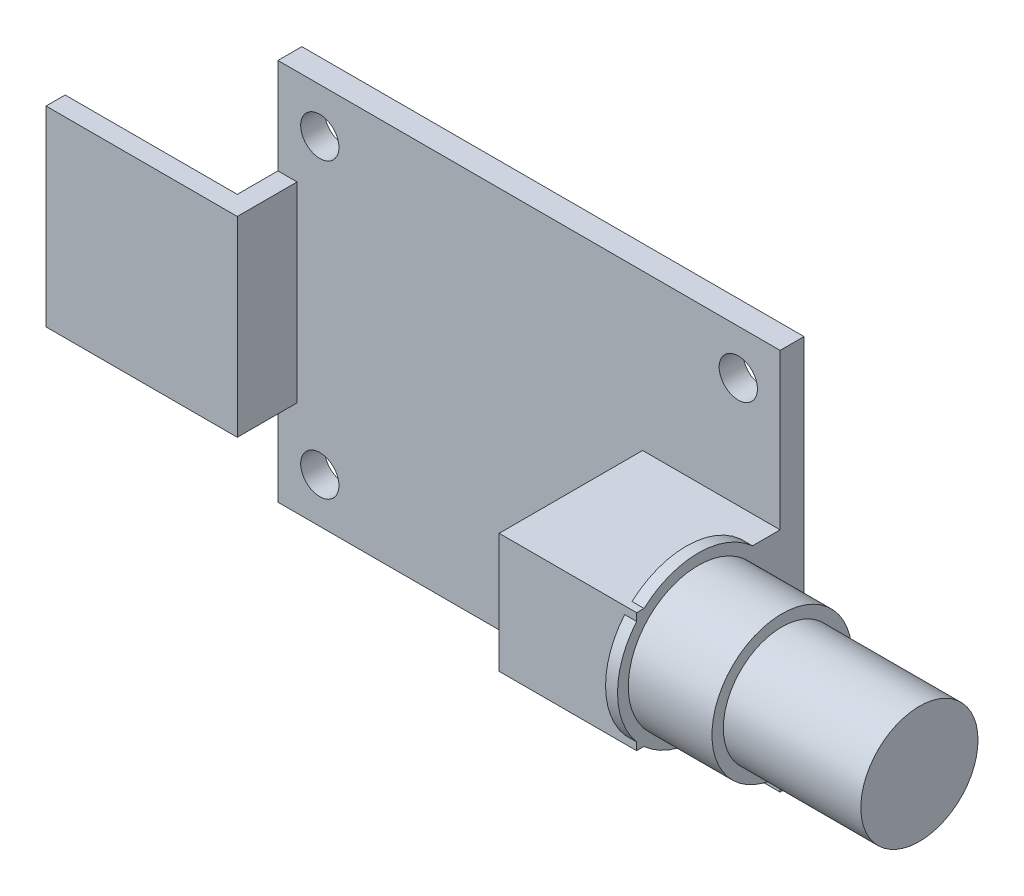
ISO-10303-21;
HEADER;
FILE_DESCRIPTION(('STEP AP214'),'2;1');
FILE_NAME('part.step','',(''),(''),'','','');
FILE_SCHEMA(('AUTOMOTIVE_DESIGN { 1 0 10303 214 1 1 1 1 }'));
ENDSEC;
DATA;
#1=APPLICATION_CONTEXT('core data for automotive mechanical design processes');
#2=APPLICATION_PROTOCOL_DEFINITION('international standard','automotive_design',2000,#1);
#3=PRODUCT_CONTEXT('',#1,'mechanical');
#4=PRODUCT('Part','Part','',(#3));
#5=PRODUCT_RELATED_PRODUCT_CATEGORY('part','',(#4));
#6=PRODUCT_DEFINITION_FORMATION('','',#4);
#7=PRODUCT_DEFINITION_CONTEXT('part definition',#1,'design');
#8=PRODUCT_DEFINITION('design','',#6,#7);
#9=PRODUCT_DEFINITION_SHAPE('','',#8);
#10=(LENGTH_UNIT() NAMED_UNIT(*) SI_UNIT(.MILLI.,.METRE.));
#11=(NAMED_UNIT(*) PLANE_ANGLE_UNIT() SI_UNIT($,.RADIAN.));
#12=(NAMED_UNIT(*) SI_UNIT($,.STERADIAN.) SOLID_ANGLE_UNIT());
#13=UNCERTAINTY_MEASURE_WITH_UNIT(LENGTH_MEASURE(1.E-05),#10,'distance_accuracy_value','');
#14=(GEOMETRIC_REPRESENTATION_CONTEXT(3) GLOBAL_UNCERTAINTY_ASSIGNED_CONTEXT((#13)) GLOBAL_UNIT_ASSIGNED_CONTEXT((#10,
#11,#12)) REPRESENTATION_CONTEXT('',''));
#15=CARTESIAN_POINT('',(0.,0.,0.));
#16=DIRECTION('',(0.,0.,1.));
#17=DIRECTION('',(1.,0.,0.));
#18=AXIS2_PLACEMENT_3D('',#15,#16,#17);
#19=CARTESIAN_POINT('',(39.5,-2.,8.85));
#20=DIRECTION('',(-1.,0.,0.));
#21=DIRECTION('',(0.,0.,1.));
#22=AXIS2_PLACEMENT_3D('',#19,#20,#21);
#23=CYLINDRICAL_SURFACE('',#22,6.75);
#24=CARTESIAN_POINT('',(21.,-2.,8.85));
#25=DIRECTION('',(1.,0.,0.));
#26=DIRECTION('',(0.,0.,-1.));
#27=AXIS2_PLACEMENT_3D('',#24,#25,#26);
#28=CIRCLE('',#27,6.75);
#29=CARTESIAN_POINT('',(21.,3.,13.3845892868043));
#30=VERTEX_POINT('',#29);
#31=CARTESIAN_POINT('',(21.,3.,4.31541071319574));
#32=VERTEX_POINT('',#31);
#33=EDGE_CURVE('E232',#30,#32,#28,.F.);
#34=ORIENTED_EDGE('',*,*,#33,.T.);
#35=DIRECTION('',(-1.,0.,0.));
#36=VECTOR('',#35,1.);
#37=CARTESIAN_POINT('',(39.5,3.00000000000001,4.31541071319574));
#38=LINE('',#37,#36);
#39=CARTESIAN_POINT('',(20.,3.,4.31541071319574));
#40=VERTEX_POINT('',#39);
#41=EDGE_CURVE('E258',#32,#40,#38,.T.);
#42=ORIENTED_EDGE('',*,*,#41,.T.);
#43=CARTESIAN_POINT('',(20.,-2.,8.85));
#44=DIRECTION('',(1.,0.,0.));
#45=DIRECTION('',(0.,0.,-1.));
#46=AXIS2_PLACEMENT_3D('',#43,#44,#45);
#47=CIRCLE('',#46,6.75);
#48=CARTESIAN_POINT('',(20.,3.,13.3845892868043));
#49=VERTEX_POINT('',#48);
#50=EDGE_CURVE('E242',#40,#49,#47,.T.);
#51=ORIENTED_EDGE('',*,*,#50,.T.);
#52=DIRECTION('',(-1.,0.,0.));
#53=VECTOR('',#52,1.);
#54=CARTESIAN_POINT('',(39.5,3.00000000000001,13.3845892868043));
#55=LINE('',#54,#53);
#56=EDGE_CURVE('E252',#49,#30,#55,.F.);
#57=ORIENTED_EDGE('',*,*,#56,.T.);
#58=EDGE_LOOP('',(#34,#42,#51,#57));
#59=FACE_BOUND('',#58,.T.);
#60=ADVANCED_FACE('F40',(#59),#23,.T.);
#61=CARTESIAN_POINT('',(21.,-6.36348484585428,14.));
#62=VERTEX_POINT('',#61);
#63=CARTESIAN_POINT('',(21.,2.36348484585429,14.));
#64=VERTEX_POINT('',#63);
#65=EDGE_CURVE('E238',#62,#64,#28,.F.);
#66=ORIENTED_EDGE('',*,*,#65,.T.);
#67=DIRECTION('',(-1.,0.,0.));
#68=VECTOR('',#67,1.);
#69=CARTESIAN_POINT('',(39.5,2.36348484585429,14.));
#70=LINE('',#69,#68);
#71=CARTESIAN_POINT('',(20.,2.36348484585429,14.));
#72=VERTEX_POINT('',#71);
#73=EDGE_CURVE('E13',#72,#64,#70,.F.);
#74=ORIENTED_EDGE('',*,*,#73,.F.);
#75=CARTESIAN_POINT('',(20.,-6.36348484585428,14.));
#76=VERTEX_POINT('',#75);
#77=EDGE_CURVE('E246',#72,#76,#47,.T.);
#78=ORIENTED_EDGE('',*,*,#77,.T.);
#79=DIRECTION('',(-1.,0.,0.));
#80=VECTOR('',#79,1.);
#81=CARTESIAN_POINT('',(39.5,-6.36348484585428,14.));
#82=LINE('',#81,#80);
#83=EDGE_CURVE('E48',#62,#76,#82,.T.);
#84=ORIENTED_EDGE('',*,*,#83,.F.);
#85=EDGE_LOOP('',(#66,#74,#78,#84));
#86=FACE_BOUND('',#85,.T.);
#87=ADVANCED_FACE('F358',(#86),#23,.T.);
#88=CARTESIAN_POINT('',(21.,-6.99999999999999,4.31541071319574));
#89=VERTEX_POINT('',#88);
#90=CARTESIAN_POINT('',(21.,-7.,13.3845892868043));
#91=VERTEX_POINT('',#90);
#92=EDGE_CURVE('E235',#89,#91,#28,.F.);
#93=ORIENTED_EDGE('',*,*,#92,.T.);
#94=DIRECTION('',(-1.,0.,0.));
#95=VECTOR('',#94,1.);
#96=CARTESIAN_POINT('',(39.5,-6.99999999999999,13.3845892868043));
#97=LINE('',#96,#95);
#98=CARTESIAN_POINT('',(20.,-7.,13.3845892868043));
#99=VERTEX_POINT('',#98);
#100=EDGE_CURVE('E250',#91,#99,#97,.T.);
#101=ORIENTED_EDGE('',*,*,#100,.T.);
#102=CARTESIAN_POINT('',(20.,-7.,4.31541071319574));
#103=VERTEX_POINT('',#102);
#104=EDGE_CURVE('E241',#99,#103,#47,.T.);
#105=ORIENTED_EDGE('',*,*,#104,.T.);
#106=DIRECTION('',(-1.,0.,0.));
#107=VECTOR('',#106,1.);
#108=CARTESIAN_POINT('',(39.5,-6.99999999999999,4.31541071319574));
#109=LINE('',#108,#107);
#110=EDGE_CURVE('E255',#103,#89,#109,.F.);
#111=ORIENTED_EDGE('',*,*,#110,.T.);
#112=EDGE_LOOP('',(#93,#101,#105,#111));
#113=FACE_BOUND('',#112,.T.);
#114=ADVANCED_FACE('F365',(#113),#23,.T.);
#115=CARTESIAN_POINT('',(21.,3.,14.));
#116=DIRECTION('',(0.,-1.,0.));
#117=DIRECTION('',(1.,0.,0.));
#118=AXIS2_PLACEMENT_3D('',#115,#116,#117);
#119=PLANE('',#118);
#120=ORIENTED_EDGE('',*,*,#56,.F.);
#121=DIRECTION('',(0.,0.,1.));
#122=VECTOR('',#121,1.);
#123=CARTESIAN_POINT('',(20.,3.,14.));
#124=LINE('',#123,#122);
#125=EDGE_CURVE('E248',#40,#49,#124,.T.);
#126=ORIENTED_EDGE('',*,*,#125,.F.);
#127=ORIENTED_EDGE('',*,*,#41,.F.);
#128=DIRECTION('',(0.,0.,-1.));
#129=VECTOR('',#128,1.);
#130=CARTESIAN_POINT('',(21.,3.,14.));
#131=LINE('',#130,#129);
#132=CARTESIAN_POINT('',(21.,3.,2.));
#133=VERTEX_POINT('',#132);
#134=EDGE_CURVE('E289',#32,#133,#131,.T.);
#135=ORIENTED_EDGE('',*,*,#134,.T.);
#136=DIRECTION('',(-1.,0.,0.));
#137=VECTOR('',#136,1.);
#138=CARTESIAN_POINT('',(21.,3.,2.));
#139=LINE('',#138,#137);
#140=CARTESIAN_POINT('',(9.49999999999999,3.,2.));
#141=VERTEX_POINT('',#140);
#142=EDGE_CURVE('E260',#133,#141,#139,.T.);
#143=ORIENTED_EDGE('',*,*,#142,.T.);
#144=DIRECTION('',(0.,0.,-1.));
#145=VECTOR('',#144,1.);
#146=CARTESIAN_POINT('',(9.49999999999999,3.,14.));
#147=LINE('',#146,#145);
#148=CARTESIAN_POINT('',(9.49999999999999,3.,14.));
#149=VERTEX_POINT('',#148);
#150=EDGE_CURVE('E286',#149,#141,#147,.T.);
#151=ORIENTED_EDGE('',*,*,#150,.F.);
#152=DIRECTION('',(-1.,0.,0.));
#153=VECTOR('',#152,1.);
#154=CARTESIAN_POINT('',(21.,3.,14.));
#155=LINE('',#154,#153);
#156=CARTESIAN_POINT('',(21.,3.,14.));
#157=VERTEX_POINT('',#156);
#158=EDGE_CURVE('E264',#157,#149,#155,.T.);
#159=ORIENTED_EDGE('',*,*,#158,.F.);
#160=EDGE_CURVE('E290',#157,#30,#131,.T.);
#161=ORIENTED_EDGE('',*,*,#160,.T.);
#162=EDGE_LOOP('',(#120,#126,#127,#135,#143,#151,#159,#161));
#163=FACE_BOUND('',#162,.T.);
#164=ADVANCED_FACE('F400',(#163),#119,.F.);
#165=CARTESIAN_POINT('',(21.,-7.,14.));
#166=DIRECTION('',(0.,1.,0.));
#167=DIRECTION('',(-1.,0.,0.));
#168=AXIS2_PLACEMENT_3D('',#165,#166,#167);
#169=PLANE('',#168);
#170=ORIENTED_EDGE('',*,*,#110,.F.);
#171=DIRECTION('',(0.,0.,-1.));
#172=VECTOR('',#171,1.);
#173=CARTESIAN_POINT('',(20.,-7.,14.));
#174=LINE('',#173,#172);
#175=EDGE_CURVE('E245',#99,#103,#174,.T.);
#176=ORIENTED_EDGE('',*,*,#175,.F.);
#177=ORIENTED_EDGE('',*,*,#100,.F.);
#178=DIRECTION('',(0.,0.,-1.));
#179=VECTOR('',#178,1.);
#180=CARTESIAN_POINT('',(21.,-7.,14.));
#181=LINE('',#180,#179);
#182=CARTESIAN_POINT('',(21.,-7.,14.));
#183=VERTEX_POINT('',#182);
#184=EDGE_CURVE('E280',#183,#91,#181,.T.);
#185=ORIENTED_EDGE('',*,*,#184,.F.);
#186=DIRECTION('',(1.,0.,0.));
#187=VECTOR('',#186,1.);
#188=CARTESIAN_POINT('',(21.,-7.,14.));
#189=LINE('',#188,#187);
#190=CARTESIAN_POINT('',(9.49999999999999,-7.,14.));
#191=VERTEX_POINT('',#190);
#192=EDGE_CURVE('E269',#191,#183,#189,.T.);
#193=ORIENTED_EDGE('',*,*,#192,.F.);
#194=DIRECTION('',(0.,0.,-1.));
#195=VECTOR('',#194,1.);
#196=CARTESIAN_POINT('',(9.49999999999999,-7.,14.));
#197=LINE('',#196,#195);
#198=CARTESIAN_POINT('',(9.49999999999999,-7.,2.));
#199=VERTEX_POINT('',#198);
#200=EDGE_CURVE('E283',#191,#199,#197,.T.);
#201=ORIENTED_EDGE('',*,*,#200,.T.);
#202=DIRECTION('',(1.,0.,0.));
#203=VECTOR('',#202,1.);
#204=CARTESIAN_POINT('',(21.,-7.,2.));
#205=LINE('',#204,#203);
#206=CARTESIAN_POINT('',(21.,-7.,2.));
#207=VERTEX_POINT('',#206);
#208=EDGE_CURVE('E277',#199,#207,#205,.T.);
#209=ORIENTED_EDGE('',*,*,#208,.T.);
#210=EDGE_CURVE('E271',#89,#207,#181,.T.);
#211=ORIENTED_EDGE('',*,*,#210,.F.);
#212=EDGE_LOOP('',(#170,#176,#177,#185,#193,#201,#209,#211));
#213=FACE_BOUND('',#212,.T.);
#214=ADVANCED_FACE('F371',(#213),#169,.F.);
#215=CARTESIAN_POINT('',(0.,0.,14.));
#216=DIRECTION('',(0.,0.,1.));
#217=DIRECTION('',(1.,0.,0.));
#218=AXIS2_PLACEMENT_3D('',#215,#216,#217);
#219=PLANE('',#218);
#220=DIRECTION('',(0.,1.,0.));
#221=VECTOR('',#220,1.);
#222=CARTESIAN_POINT('',(20.,0.,14.));
#223=LINE('',#222,#221);
#224=EDGE_CURVE('E349',#76,#72,#223,.T.);
#225=ORIENTED_EDGE('',*,*,#224,.T.);
#226=ORIENTED_EDGE('',*,*,#73,.T.);
#227=DIRECTION('',(0.,1.,0.));
#228=VECTOR('',#227,1.);
#229=CARTESIAN_POINT('',(21.,-7.,14.));
#230=LINE('',#229,#228);
#231=EDGE_CURVE('E265',#64,#157,#230,.T.);
#232=ORIENTED_EDGE('',*,*,#231,.T.);
#233=ORIENTED_EDGE('',*,*,#158,.T.);
#234=DIRECTION('',(0.,-1.,0.));
#235=VECTOR('',#234,1.);
#236=CARTESIAN_POINT('',(9.49999999999999,-7.,14.));
#237=LINE('',#236,#235);
#238=EDGE_CURVE('E267',#149,#191,#237,.T.);
#239=ORIENTED_EDGE('',*,*,#238,.T.);
#240=ORIENTED_EDGE('',*,*,#192,.T.);
#241=EDGE_CURVE('E261',#183,#62,#230,.T.);
#242=ORIENTED_EDGE('',*,*,#241,.T.);
#243=ORIENTED_EDGE('',*,*,#83,.T.);
#244=EDGE_LOOP('',(#225,#226,#232,#233,#239,#240,#242,#243));
#245=FACE_BOUND('',#244,.T.);
#246=ADVANCED_FACE('F354',(#245),#219,.T.);
#247=CARTESIAN_POINT('',(0.,0.,2.));
#248=DIRECTION('',(0.,0.,1.));
#249=DIRECTION('',(1.,0.,0.));
#250=AXIS2_PLACEMENT_3D('',#247,#248,#249);
#251=PLANE('',#250);
#252=DIRECTION('',(-1.,0.,0.));
#253=VECTOR('',#252,1.);
#254=CARTESIAN_POINT('',(-19.4,8.,2.));
#255=LINE('',#254,#253);
#256=CARTESIAN_POINT('',(-19.4,8.,2.));
#257=VERTEX_POINT('',#256);
#258=CARTESIAN_POINT('',(-21.,8.,2.));
#259=VERTEX_POINT('',#258);
#260=EDGE_CURVE('E55',#257,#259,#255,.T.);
#261=ORIENTED_EDGE('',*,*,#260,.F.);
#262=DIRECTION('',(0.,-1.,0.));
#263=VECTOR('',#262,1.);
#264=CARTESIAN_POINT('',(-19.4,8.,2.));
#265=LINE('',#264,#263);
#266=CARTESIAN_POINT('',(-19.4,-8.,2.));
#267=VERTEX_POINT('',#266);
#268=EDGE_CURVE('E60',#257,#267,#265,.T.);
#269=ORIENTED_EDGE('',*,*,#268,.T.);
#270=DIRECTION('',(-1.,0.,0.));
#271=VECTOR('',#270,1.);
#272=CARTESIAN_POINT('',(-19.4,-8.,2.));
#273=LINE('',#272,#271);
#274=CARTESIAN_POINT('',(-21.,-8.,2.));
#275=VERTEX_POINT('',#274);
#276=EDGE_CURVE('E207',#267,#275,#273,.T.);
#277=ORIENTED_EDGE('',*,*,#276,.T.);
#278=DIRECTION('',(0.,-1.,0.));
#279=VECTOR('',#278,1.);
#280=CARTESIAN_POINT('',(-21.,16.,2.));
#281=LINE('',#280,#279);
#282=CARTESIAN_POINT('',(-21.,-16.,2.));
#283=VERTEX_POINT('',#282);
#284=EDGE_CURVE('E324',#275,#283,#281,.T.);
#285=ORIENTED_EDGE('',*,*,#284,.T.);
#286=DIRECTION('',(1.,0.,0.));
#287=VECTOR('',#286,1.);
#288=CARTESIAN_POINT('',(-21.,-16.,2.));
#289=LINE('',#288,#287);
#290=CARTESIAN_POINT('',(21.,-16.,2.));
#291=VERTEX_POINT('',#290);
#292=EDGE_CURVE('E327',#283,#291,#289,.T.);
#293=ORIENTED_EDGE('',*,*,#292,.T.);
#294=DIRECTION('',(0.,1.,0.));
#295=VECTOR('',#294,1.);
#296=CARTESIAN_POINT('',(21.,16.,2.));
#297=LINE('',#296,#295);
#298=EDGE_CURVE('E318',#291,#207,#297,.T.);
#299=ORIENTED_EDGE('',*,*,#298,.T.);
#300=ORIENTED_EDGE('',*,*,#208,.F.);
#301=DIRECTION('',(0.,-1.,0.));
#302=VECTOR('',#301,1.);
#303=CARTESIAN_POINT('',(9.49999999999999,-7.,2.));
#304=LINE('',#303,#302);
#305=EDGE_CURVE('E274',#141,#199,#304,.T.);
#306=ORIENTED_EDGE('',*,*,#305,.F.);
#307=ORIENTED_EDGE('',*,*,#142,.F.);
#308=CARTESIAN_POINT('',(21.,16.,2.));
#309=VERTEX_POINT('',#308);
#310=EDGE_CURVE('E322',#133,#309,#297,.T.);
#311=ORIENTED_EDGE('',*,*,#310,.T.);
#312=DIRECTION('',(-1.,0.,0.));
#313=VECTOR('',#312,1.);
#314=CARTESIAN_POINT('',(-21.,16.,2.));
#315=LINE('',#314,#313);
#316=CARTESIAN_POINT('',(-21.,16.,2.));
#317=VERTEX_POINT('',#316);
#318=EDGE_CURVE('E321',#309,#317,#315,.T.);
#319=ORIENTED_EDGE('',*,*,#318,.T.);
#320=EDGE_CURVE('E325',#317,#259,#281,.T.);
#321=ORIENTED_EDGE('',*,*,#320,.T.);
#322=EDGE_LOOP('',(#261,#269,#277,#285,#293,#299,#300,#306,#307,#311,#319,#321));
#323=FACE_BOUND('',#322,.T.);
#324=CARTESIAN_POINT('',(17.5,-12.25,2.));
#325=DIRECTION('',(0.,0.,1.));
#326=DIRECTION('',(1.,0.,0.));
#327=AXIS2_PLACEMENT_3D('',#324,#325,#326);
#328=CIRCLE('',#327,1.6);
#329=CARTESIAN_POINT('',(19.1,-12.25,2.));
#330=VERTEX_POINT('',#329);
#331=EDGE_CURVE('E300',#330,#330,#328,.T.);
#332=ORIENTED_EDGE('',*,*,#331,.F.);
#333=EDGE_LOOP('',(#332));
#334=FACE_BOUND('',#333,.T.);
#335=CARTESIAN_POINT('',(-17.5,12.25,2.));
#336=DIRECTION('',(0.,0.,1.));
#337=DIRECTION('',(1.,0.,0.));
#338=AXIS2_PLACEMENT_3D('',#335,#336,#337);
#339=CIRCLE('',#338,1.6);
#340=CARTESIAN_POINT('',(-15.9,12.25,2.));
#341=VERTEX_POINT('',#340);
#342=EDGE_CURVE('E312',#341,#341,#339,.T.);
#343=ORIENTED_EDGE('',*,*,#342,.F.);
#344=EDGE_LOOP('',(#343));
#345=FACE_BOUND('',#344,.T.);
#346=CARTESIAN_POINT('',(-17.5,-12.25,2.));
#347=DIRECTION('',(0.,0.,1.));
#348=DIRECTION('',(1.,0.,0.));
#349=AXIS2_PLACEMENT_3D('',#346,#347,#348);
#350=CIRCLE('',#349,1.6);
#351=CARTESIAN_POINT('',(-15.9,-12.25,2.));
#352=VERTEX_POINT('',#351);
#353=EDGE_CURVE('E306',#352,#352,#350,.T.);
#354=ORIENTED_EDGE('',*,*,#353,.F.);
#355=EDGE_LOOP('',(#354));
#356=FACE_BOUND('',#355,.T.);
#357=CARTESIAN_POINT('',(17.5,12.25,2.));
#358=DIRECTION('',(0.,0.,1.));
#359=DIRECTION('',(1.,0.,0.));
#360=AXIS2_PLACEMENT_3D('',#357,#358,#359);
#361=CIRCLE('',#360,1.6);
#362=CARTESIAN_POINT('',(19.1,12.25,2.));
#363=VERTEX_POINT('',#362);
#364=EDGE_CURVE('E294',#363,#363,#361,.T.);
#365=ORIENTED_EDGE('',*,*,#364,.F.);
#366=EDGE_LOOP('',(#365));
#367=FACE_BOUND('',#366,.T.);
#368=ADVANCED_FACE('F376',(#323,#334,#345,#356,#367),#251,.T.);
#369=CARTESIAN_POINT('',(0.,0.,0.));
#370=DIRECTION('',(0.,0.,1.));
#371=DIRECTION('',(1.,0.,0.));
#372=AXIS2_PLACEMENT_3D('',#369,#370,#371);
#373=PLANE('',#372);
#374=DIRECTION('',(0.,1.,0.));
#375=VECTOR('',#374,1.);
#376=CARTESIAN_POINT('',(21.,16.,0.));
#377=LINE('',#376,#375);
#378=CARTESIAN_POINT('',(21.,-16.,0.));
#379=VERTEX_POINT('',#378);
#380=CARTESIAN_POINT('',(21.,16.,0.));
#381=VERTEX_POINT('',#380);
#382=EDGE_CURVE('E315',#379,#381,#377,.T.);
#383=ORIENTED_EDGE('',*,*,#382,.F.);
#384=DIRECTION('',(1.,0.,0.));
#385=VECTOR('',#384,1.);
#386=CARTESIAN_POINT('',(-21.,-16.,0.));
#387=LINE('',#386,#385);
#388=CARTESIAN_POINT('',(-21.,-16.,0.));
#389=VERTEX_POINT('',#388);
#390=EDGE_CURVE('E336',#389,#379,#387,.T.);
#391=ORIENTED_EDGE('',*,*,#390,.F.);
#392=DIRECTION('',(0.,-1.,0.));
#393=VECTOR('',#392,1.);
#394=CARTESIAN_POINT('',(-21.,16.,0.));
#395=LINE('',#394,#393);
#396=CARTESIAN_POINT('',(-21.,16.,0.));
#397=VERTEX_POINT('',#396);
#398=EDGE_CURVE('E334',#397,#389,#395,.T.);
#399=ORIENTED_EDGE('',*,*,#398,.F.);
#400=DIRECTION('',(-1.,0.,0.));
#401=VECTOR('',#400,1.);
#402=CARTESIAN_POINT('',(-21.,16.,0.));
#403=LINE('',#402,#401);
#404=EDGE_CURVE('E332',#381,#397,#403,.T.);
#405=ORIENTED_EDGE('',*,*,#404,.F.);
#406=EDGE_LOOP('',(#383,#391,#399,#405));
#407=FACE_BOUND('',#406,.T.);
#408=CARTESIAN_POINT('',(-17.5,12.25,0.));
#409=DIRECTION('',(0.,0.,1.));
#410=DIRECTION('',(1.,0.,0.));
#411=AXIS2_PLACEMENT_3D('',#408,#409,#410);
#412=CIRCLE('',#411,1.6);
#413=CARTESIAN_POINT('',(-15.9,12.25,0.));
#414=VERTEX_POINT('',#413);
#415=EDGE_CURVE('E309',#414,#414,#412,.T.);
#416=ORIENTED_EDGE('',*,*,#415,.T.);
#417=EDGE_LOOP('',(#416));
#418=FACE_BOUND('',#417,.T.);
#419=CARTESIAN_POINT('',(-17.5,-12.25,0.));
#420=DIRECTION('',(0.,0.,1.));
#421=DIRECTION('',(1.,0.,0.));
#422=AXIS2_PLACEMENT_3D('',#419,#420,#421);
#423=CIRCLE('',#422,1.6);
#424=CARTESIAN_POINT('',(-15.9,-12.25,0.));
#425=VERTEX_POINT('',#424);
#426=EDGE_CURVE('E303',#425,#425,#423,.T.);
#427=ORIENTED_EDGE('',*,*,#426,.T.);
#428=EDGE_LOOP('',(#427));
#429=FACE_BOUND('',#428,.T.);
#430=CARTESIAN_POINT('',(17.5,-12.25,0.));
#431=DIRECTION('',(0.,0.,1.));
#432=DIRECTION('',(1.,0.,0.));
#433=AXIS2_PLACEMENT_3D('',#430,#431,#432);
#434=CIRCLE('',#433,1.6);
#435=CARTESIAN_POINT('',(19.1,-12.25,0.));
#436=VERTEX_POINT('',#435);
#437=EDGE_CURVE('E297',#436,#436,#434,.T.);
#438=ORIENTED_EDGE('',*,*,#437,.T.);
#439=EDGE_LOOP('',(#438));
#440=FACE_BOUND('',#439,.T.);
#441=CARTESIAN_POINT('',(17.5,12.25,0.));
#442=DIRECTION('',(0.,0.,1.));
#443=DIRECTION('',(1.,0.,0.));
#444=AXIS2_PLACEMENT_3D('',#441,#442,#443);
#445=CIRCLE('',#444,1.6);
#446=CARTESIAN_POINT('',(19.1,12.25,0.));
#447=VERTEX_POINT('',#446);
#448=EDGE_CURVE('E293',#447,#447,#445,.T.);
#449=ORIENTED_EDGE('',*,*,#448,.T.);
#450=EDGE_LOOP('',(#449));
#451=FACE_BOUND('',#450,.T.);
#452=ADVANCED_FACE('F387',(#407,#418,#429,#440,#451),#373,.F.);
#453=CARTESIAN_POINT('',(21.,16.,2.));
#454=DIRECTION('',(-1.,0.,0.));
#455=DIRECTION('',(0.,0.,1.));
#456=AXIS2_PLACEMENT_3D('',#453,#454,#455);
#457=PLANE('',#456);
#458=ORIENTED_EDGE('',*,*,#231,.F.);
#459=ORIENTED_EDGE('',*,*,#65,.F.);
#460=ORIENTED_EDGE('',*,*,#241,.F.);
#461=ORIENTED_EDGE('',*,*,#184,.T.);
#462=ORIENTED_EDGE('',*,*,#92,.F.);
#463=ORIENTED_EDGE('',*,*,#210,.T.);
#464=ORIENTED_EDGE('',*,*,#298,.F.);
#465=DIRECTION('',(0.,0.,-1.));
#466=VECTOR('',#465,1.);
#467=CARTESIAN_POINT('',(21.,-16.,2.));
#468=LINE('',#467,#466);
#469=EDGE_CURVE('E329',#291,#379,#468,.T.);
#470=ORIENTED_EDGE('',*,*,#469,.T.);
#471=ORIENTED_EDGE('',*,*,#382,.T.);
#472=DIRECTION('',(0.,0.,-1.));
#473=VECTOR('',#472,1.);
#474=CARTESIAN_POINT('',(21.,16.,2.));
#475=LINE('',#474,#473);
#476=EDGE_CURVE('E346',#309,#381,#475,.T.);
#477=ORIENTED_EDGE('',*,*,#476,.F.);
#478=ORIENTED_EDGE('',*,*,#310,.F.);
#479=ORIENTED_EDGE('',*,*,#134,.F.);
#480=ORIENTED_EDGE('',*,*,#33,.F.);
#481=ORIENTED_EDGE('',*,*,#160,.F.);
#482=EDGE_LOOP('',(#458,#459,#460,#461,#462,#463,#464,#470,#471,#477,#478,#479,#480,#481));
#483=FACE_BOUND('',#482,.T.);
#484=CARTESIAN_POINT('',(21.,-2.,8.85));
#485=DIRECTION('',(1.,0.,0.));
#486=DIRECTION('',(0.,0.,-1.));
#487=AXIS2_PLACEMENT_3D('',#484,#485,#486);
#488=CIRCLE('',#487,5.85);
#489=CARTESIAN_POINT('',(21.,-2.,3.));
#490=VERTEX_POINT('',#489);
#491=EDGE_CURVE('E237',#490,#490,#488,.F.);
#492=ORIENTED_EDGE('',*,*,#491,.T.);
#493=EDGE_LOOP('',(#492));
#494=FACE_BOUND('',#493,.T.);
#495=ADVANCED_FACE('F42',(#483,#494),#457,.F.);
#496=CARTESIAN_POINT('',(-21.,16.,2.));
#497=DIRECTION('',(0.,-1.,0.));
#498=DIRECTION('',(0.,0.,-1.));
#499=AXIS2_PLACEMENT_3D('',#496,#497,#498);
#500=PLANE('',#499);
#501=ORIENTED_EDGE('',*,*,#404,.T.);
#502=DIRECTION('',(0.,0.,-1.));
#503=VECTOR('',#502,1.);
#504=CARTESIAN_POINT('',(-21.,16.,2.));
#505=LINE('',#504,#503);
#506=EDGE_CURVE('E343',#317,#397,#505,.T.);
#507=ORIENTED_EDGE('',*,*,#506,.F.);
#508=ORIENTED_EDGE('',*,*,#318,.F.);
#509=ORIENTED_EDGE('',*,*,#476,.T.);
#510=EDGE_LOOP('',(#501,#507,#508,#509));
#511=FACE_BOUND('',#510,.T.);
#512=ADVANCED_FACE('F393',(#511),#500,.F.);
#513=CARTESIAN_POINT('',(-21.,16.,2.));
#514=DIRECTION('',(1.,0.,0.));
#515=DIRECTION('',(0.,1.,0.));
#516=AXIS2_PLACEMENT_3D('',#513,#514,#515);
#517=PLANE('',#516);
#518=ORIENTED_EDGE('',*,*,#398,.T.);
#519=DIRECTION('',(0.,0.,-1.));
#520=VECTOR('',#519,1.);
#521=CARTESIAN_POINT('',(-21.,-16.,2.));
#522=LINE('',#521,#520);
#523=EDGE_CURVE('E340',#283,#389,#522,.T.);
#524=ORIENTED_EDGE('',*,*,#523,.F.);
#525=ORIENTED_EDGE('',*,*,#284,.F.);
#526=DIRECTION('',(0.,0.,1.));
#527=VECTOR('',#526,1.);
#528=CARTESIAN_POINT('',(-21.,-8.,2.));
#529=LINE('',#528,#527);
#530=CARTESIAN_POINT('',(-21.,-8.,5.4));
#531=VERTEX_POINT('',#530);
#532=EDGE_CURVE('E189',#275,#531,#529,.T.);
#533=ORIENTED_EDGE('',*,*,#532,.T.);
#534=DIRECTION('',(0.,-1.,0.));
#535=VECTOR('',#534,1.);
#536=CARTESIAN_POINT('',(-21.,8.,5.4));
#537=LINE('',#536,#535);
#538=CARTESIAN_POINT('',(-21.,8.,5.4));
#539=VERTEX_POINT('',#538);
#540=EDGE_CURVE('E186',#539,#531,#537,.T.);
#541=ORIENTED_EDGE('',*,*,#540,.F.);
#542=DIRECTION('',(0.,0.,1.));
#543=VECTOR('',#542,1.);
#544=CARTESIAN_POINT('',(-21.,8.,2.));
#545=LINE('',#544,#543);
#546=EDGE_CURVE('E176',#259,#539,#545,.T.);
#547=ORIENTED_EDGE('',*,*,#546,.F.);
#548=ORIENTED_EDGE('',*,*,#320,.F.);
#549=ORIENTED_EDGE('',*,*,#506,.T.);
#550=EDGE_LOOP('',(#518,#524,#525,#533,#541,#547,#548,#549));
#551=FACE_BOUND('',#550,.T.);
#552=ADVANCED_FACE('F187',(#551),#517,.F.);
#553=CARTESIAN_POINT('',(-21.,-16.,2.));
#554=DIRECTION('',(0.,1.,0.));
#555=DIRECTION('',(0.,0.,1.));
#556=AXIS2_PLACEMENT_3D('',#553,#554,#555);
#557=PLANE('',#556);
#558=ORIENTED_EDGE('',*,*,#390,.T.);
#559=ORIENTED_EDGE('',*,*,#469,.F.);
#560=ORIENTED_EDGE('',*,*,#292,.F.);
#561=ORIENTED_EDGE('',*,*,#523,.T.);
#562=EDGE_LOOP('',(#558,#559,#560,#561));
#563=FACE_BOUND('',#562,.T.);
#564=ADVANCED_FACE('F382',(#563),#557,.F.);
#565=CARTESIAN_POINT('',(-17.5,12.25,2.));
#566=DIRECTION('',(0.,0.,-1.));
#567=DIRECTION('',(-1.,0.,0.));
#568=AXIS2_PLACEMENT_3D('',#565,#566,#567);
#569=CYLINDRICAL_SURFACE('',#568,1.6);
#570=ORIENTED_EDGE('',*,*,#342,.T.);
#571=EDGE_LOOP('',(#570));
#572=FACE_BOUND('',#571,.T.);
#573=ORIENTED_EDGE('',*,*,#415,.F.);
#574=EDGE_LOOP('',(#573));
#575=FACE_BOUND('',#574,.T.);
#576=ADVANCED_FACE('F454',(#572,#575),#569,.F.);
#577=CARTESIAN_POINT('',(-17.5,-12.25,2.));
#578=DIRECTION('',(0.,0.,-1.));
#579=DIRECTION('',(-1.,0.,0.));
#580=AXIS2_PLACEMENT_3D('',#577,#578,#579);
#581=CYLINDRICAL_SURFACE('',#580,1.6);
#582=ORIENTED_EDGE('',*,*,#353,.T.);
#583=EDGE_LOOP('',(#582));
#584=FACE_BOUND('',#583,.T.);
#585=ORIENTED_EDGE('',*,*,#426,.F.);
#586=EDGE_LOOP('',(#585));
#587=FACE_BOUND('',#586,.T.);
#588=ADVANCED_FACE('F450',(#584,#587),#581,.F.);
#589=CARTESIAN_POINT('',(17.5,-12.25,2.));
#590=DIRECTION('',(0.,0.,-1.));
#591=DIRECTION('',(-1.,0.,0.));
#592=AXIS2_PLACEMENT_3D('',#589,#590,#591);
#593=CYLINDRICAL_SURFACE('',#592,1.6);
#594=ORIENTED_EDGE('',*,*,#331,.T.);
#595=EDGE_LOOP('',(#594));
#596=FACE_BOUND('',#595,.T.);
#597=ORIENTED_EDGE('',*,*,#437,.F.);
#598=EDGE_LOOP('',(#597));
#599=FACE_BOUND('',#598,.T.);
#600=ADVANCED_FACE('F446',(#596,#599),#593,.F.);
#601=CARTESIAN_POINT('',(17.5,12.25,2.));
#602=DIRECTION('',(0.,0.,-1.));
#603=DIRECTION('',(-1.,0.,0.));
#604=AXIS2_PLACEMENT_3D('',#601,#602,#603);
#605=CYLINDRICAL_SURFACE('',#604,1.6);
#606=ORIENTED_EDGE('',*,*,#364,.T.);
#607=EDGE_LOOP('',(#606));
#608=FACE_BOUND('',#607,.T.);
#609=ORIENTED_EDGE('',*,*,#448,.F.);
#610=EDGE_LOOP('',(#609));
#611=FACE_BOUND('',#610,.T.);
#612=ADVANCED_FACE('F423',(#608,#611),#605,.F.);
#613=CARTESIAN_POINT('',(9.49999999999999,-7.,14.));
#614=DIRECTION('',(1.,0.,0.));
#615=DIRECTION('',(0.,0.,-1.));
#616=AXIS2_PLACEMENT_3D('',#613,#614,#615);
#617=PLANE('',#616);
#618=ORIENTED_EDGE('',*,*,#305,.T.);
#619=ORIENTED_EDGE('',*,*,#200,.F.);
#620=ORIENTED_EDGE('',*,*,#238,.F.);
#621=ORIENTED_EDGE('',*,*,#150,.T.);
#622=EDGE_LOOP('',(#618,#619,#620,#621));
#623=FACE_BOUND('',#622,.T.);
#624=ADVANCED_FACE('F405',(#623),#617,.F.);
#625=CARTESIAN_POINT('',(20.,-2.,8.85));
#626=DIRECTION('',(1.,0.,0.));
#627=DIRECTION('',(0.,0.,-1.));
#628=AXIS2_PLACEMENT_3D('',#625,#626,#627);
#629=PLANE('',#628);
#630=ORIENTED_EDGE('',*,*,#50,.F.);
#631=ORIENTED_EDGE('',*,*,#125,.T.);
#632=EDGE_LOOP('',(#630,#631));
#633=FACE_BOUND('',#632,.T.);
#634=ADVANCED_FACE('F414',(#633),#629,.F.);
#635=ORIENTED_EDGE('',*,*,#104,.F.);
#636=ORIENTED_EDGE('',*,*,#175,.T.);
#637=EDGE_LOOP('',(#635,#636));
#638=FACE_BOUND('',#637,.T.);
#639=ADVANCED_FACE('F416',(#638),#629,.F.);
#640=ORIENTED_EDGE('',*,*,#224,.F.);
#641=ORIENTED_EDGE('',*,*,#77,.F.);
#642=EDGE_LOOP('',(#640,#641));
#643=FACE_BOUND('',#642,.T.);
#644=ADVANCED_FACE('F418',(#643),#629,.F.);
#645=CARTESIAN_POINT('',(0.908116907963205,-2.,8.85));
#646=DIRECTION('',(1.,0.,0.));
#647=DIRECTION('',(0.,0.,-1.));
#648=AXIS2_PLACEMENT_3D('',#645,#646,#647);
#649=CYLINDRICAL_SURFACE('',#648,5.85);
#650=CARTESIAN_POINT('',(28.,-2.,8.85));
#651=DIRECTION('',(-1.,0.,0.));
#652=DIRECTION('',(0.,0.,1.));
#653=AXIS2_PLACEMENT_3D('',#650,#651,#652);
#654=CIRCLE('',#653,5.85);
#655=CARTESIAN_POINT('',(28.,-2.,3.));
#656=VERTEX_POINT('',#655);
#657=EDGE_CURVE('E192',#656,#656,#654,.F.);
#658=CARTESIAN_POINT('',(28.,-2.,3.));
#659=CARTESIAN_POINT('',(27.9270833333333,-2.,3.));
#660=CARTESIAN_POINT('',(27.8541666666667,-2.,3.));
#661=CARTESIAN_POINT('',(27.7083333333333,-2.,3.));
#662=CARTESIAN_POINT('',(27.6354166666667,-2.,3.));
#663=CARTESIAN_POINT('',(27.4895833333333,-2.,3.));
#664=CARTESIAN_POINT('',(27.4166666666667,-2.,3.));
#665=CARTESIAN_POINT('',(27.2708333333333,-2.,3.));
#666=CARTESIAN_POINT('',(27.1979166666667,-2.,3.));
#667=CARTESIAN_POINT('',(27.0520833333333,-2.,3.));
#668=CARTESIAN_POINT('',(26.9791666666667,-2.,3.));
#669=CARTESIAN_POINT('',(26.8333333333333,-2.,3.));
#670=CARTESIAN_POINT('',(26.7604166666667,-2.,3.));
#671=CARTESIAN_POINT('',(26.6145833333333,-2.,3.));
#672=CARTESIAN_POINT('',(26.5416666666667,-2.,3.));
#673=CARTESIAN_POINT('',(26.3958333333333,-2.,3.));
#674=CARTESIAN_POINT('',(26.3229166666667,-2.,3.));
#675=CARTESIAN_POINT('',(26.1770833333333,-2.,3.));
#676=CARTESIAN_POINT('',(26.1041666666667,-2.,3.));
#677=CARTESIAN_POINT('',(25.9583333333333,-2.,3.));
#678=CARTESIAN_POINT('',(25.8854166666667,-2.,3.));
#679=CARTESIAN_POINT('',(25.7395833333333,-2.,3.));
#680=CARTESIAN_POINT('',(25.6666666666667,-2.,3.));
#681=CARTESIAN_POINT('',(25.5208333333333,-2.,3.));
#682=CARTESIAN_POINT('',(25.4479166666667,-2.,3.));
#683=CARTESIAN_POINT('',(25.3020833333333,-2.,3.));
#684=CARTESIAN_POINT('',(25.2291666666667,-2.,3.));
#685=CARTESIAN_POINT('',(25.0833333333333,-2.,3.));
#686=CARTESIAN_POINT('',(25.0104166666667,-2.,3.));
#687=CARTESIAN_POINT('',(24.8645833333333,-2.,3.));
#688=CARTESIAN_POINT('',(24.7916666666667,-2.,3.));
#689=CARTESIAN_POINT('',(24.6458333333333,-2.,3.));
#690=CARTESIAN_POINT('',(24.5729166666667,-2.,3.));
#691=CARTESIAN_POINT('',(24.4270833333333,-2.,3.));
#692=CARTESIAN_POINT('',(24.3541666666667,-2.,3.));
#693=CARTESIAN_POINT('',(24.2083333333333,-2.,3.));
#694=CARTESIAN_POINT('',(24.1354166666667,-2.,3.));
#695=CARTESIAN_POINT('',(23.9895833333333,-2.,3.));
#696=CARTESIAN_POINT('',(23.9166666666667,-2.,3.));
#697=CARTESIAN_POINT('',(23.7708333333333,-2.,3.));
#698=CARTESIAN_POINT('',(23.6979166666667,-2.,3.));
#699=CARTESIAN_POINT('',(23.5520833333333,-2.,3.));
#700=CARTESIAN_POINT('',(23.4791666666667,-2.,3.));
#701=CARTESIAN_POINT('',(23.3333333333333,-2.,3.));
#702=CARTESIAN_POINT('',(23.2604166666667,-2.,3.));
#703=CARTESIAN_POINT('',(23.1145833333333,-2.,3.));
#704=CARTESIAN_POINT('',(23.0416666666667,-2.,3.));
#705=CARTESIAN_POINT('',(22.8958333333333,-2.,3.));
#706=CARTESIAN_POINT('',(22.8229166666667,-2.,3.));
#707=CARTESIAN_POINT('',(22.6770833333333,-2.,3.));
#708=CARTESIAN_POINT('',(22.6041666666667,-2.,3.));
#709=CARTESIAN_POINT('',(22.4583333333333,-2.,3.));
#710=CARTESIAN_POINT('',(22.3854166666667,-2.,3.));
#711=CARTESIAN_POINT('',(22.2395833333333,-2.,3.));
#712=CARTESIAN_POINT('',(22.1666666666667,-2.,3.));
#713=CARTESIAN_POINT('',(22.0208333333333,-2.,3.));
#714=CARTESIAN_POINT('',(21.9479166666667,-2.,3.));
#715=CARTESIAN_POINT('',(21.8020833333333,-2.,3.));
#716=CARTESIAN_POINT('',(21.7291666666667,-2.,3.));
#717=CARTESIAN_POINT('',(21.5833333333333,-2.,3.));
#718=CARTESIAN_POINT('',(21.5104166666667,-2.,3.));
#719=CARTESIAN_POINT('',(21.3645833333333,-2.,3.));
#720=CARTESIAN_POINT('',(21.2916666666667,-2.,3.));
#721=CARTESIAN_POINT('',(21.1458333333333,-2.,3.));
#722=CARTESIAN_POINT('',(21.0729166666667,-2.,3.));
#723=CARTESIAN_POINT('',(21.,-2.,3.));
#724=B_SPLINE_CURVE_WITH_KNOTS('',3,(#658,#659,#660,#661,#662,#663,#664,#665,#666,#667,#668,
#669,#670,#671,#672,#673,#674,#675,#676,#677,#678,#679,#680,#681,#682,#683,#684,#685,#686,#687,
#688,#689,#690,#691,#692,#693,#694,#695,#696,#697,#698,#699,#700,#701,#702,#703,#704,#705,#706,
#707,#708,#709,#710,#711,#712,#713,#714,#715,#716,#717,#718,#719,#720,#721,#722,#723),
.UNSPECIFIED.,.F.,.F.,(4,2,2,2,2,2,2,2,2,2,2,2,2,2,2,2,2,2,2,2,2,2,2,2,2,2,2,2,2,2,2,2,4),(0.,
0.21875,0.4375,0.656250000000001,0.875000000000001,1.09375,1.3125,1.53125,1.75,1.96875,2.1875,
2.40625,2.625,2.84375,3.0625,3.28125,3.5,3.71875,3.9375,4.15625,4.375,4.59375,4.8125,5.03125,
5.25,5.46875,5.68750000000001,5.90625000000001,6.12500000000001,6.34375000000001,
6.56250000000001,6.78125000000001,7.00000000000001),.UNSPECIFIED.);
#725=EDGE_CURVE('BSEAM428',#656,#490,#724,.T.);
#726=ORIENTED_EDGE('',*,*,#657,.F.);
#727=ORIENTED_EDGE('',*,*,#491,.F.);
#728=ORIENTED_EDGE('',*,*,#725,.T.);
#729=ORIENTED_EDGE('',*,*,#725,.F.);
#730=EDGE_LOOP('',(#726,#728,#727,#729));
#731=FACE_BOUND('',#730,.T.);
#732=ADVANCED_FACE('F428',(#731),#649,.T.);
#733=CARTESIAN_POINT('',(4.45370132023478,-2.,8.85));
#734=DIRECTION('',(1.,0.,0.));
#735=DIRECTION('',(0.,0.,-1.));
#736=AXIS2_PLACEMENT_3D('',#733,#734,#735);
#737=CYLINDRICAL_SURFACE('',#736,4.9);
#738=CARTESIAN_POINT('',(39.5,-2.,8.85));
#739=DIRECTION('',(1.,0.,0.));
#740=DIRECTION('',(0.,0.,-1.));
#741=AXIS2_PLACEMENT_3D('',#738,#739,#740);
#742=CIRCLE('',#741,4.9);
#743=CARTESIAN_POINT('',(39.5,-2.,3.95));
#744=VERTEX_POINT('',#743);
#745=EDGE_CURVE('E226',#744,#744,#742,.T.);
#746=ORIENTED_EDGE('',*,*,#745,.F.);
#747=EDGE_LOOP('',(#746));
#748=FACE_BOUND('',#747,.T.);
#749=CARTESIAN_POINT('',(28.,-2.,8.85));
#750=DIRECTION('',(-1.,0.,0.));
#751=DIRECTION('',(0.,0.,1.));
#752=AXIS2_PLACEMENT_3D('',#749,#750,#751);
#753=CIRCLE('',#752,4.9);
#754=CARTESIAN_POINT('',(28.,-2.,13.75));
#755=VERTEX_POINT('',#754);
#756=EDGE_CURVE('E229',#755,#755,#753,.F.);
#757=ORIENTED_EDGE('',*,*,#756,.T.);
#758=EDGE_LOOP('',(#757));
#759=FACE_BOUND('',#758,.T.);
#760=ADVANCED_FACE('F653',(#748,#759),#737,.T.);
#761=CARTESIAN_POINT('',(28.,16.,2.));
#762=DIRECTION('',(-1.,0.,0.));
#763=DIRECTION('',(0.,0.,1.));
#764=AXIS2_PLACEMENT_3D('',#761,#762,#763);
#765=PLANE('',#764);
#766=ORIENTED_EDGE('',*,*,#657,.T.);
#767=EDGE_LOOP('',(#766));
#768=FACE_BOUND('',#767,.T.);
#769=ORIENTED_EDGE('',*,*,#756,.F.);
#770=EDGE_LOOP('',(#769));
#771=FACE_BOUND('',#770,.T.);
#772=ADVANCED_FACE('F585',(#768,#771),#765,.F.);
#773=CARTESIAN_POINT('',(39.5,-2.,8.85));
#774=DIRECTION('',(1.,0.,0.));
#775=DIRECTION('',(0.,0.,-1.));
#776=AXIS2_PLACEMENT_3D('',#773,#774,#775);
#777=PLANE('',#776);
#778=ORIENTED_EDGE('',*,*,#745,.T.);
#779=EDGE_LOOP('',(#778));
#780=FACE_BOUND('',#779,.T.);
#781=ADVANCED_FACE('F595',(#780),#777,.T.);
#782=CARTESIAN_POINT('',(-21.,8.,5.4));
#783=DIRECTION('',(0.,0.,1.));
#784=DIRECTION('',(1.,0.,0.));
#785=AXIS2_PLACEMENT_3D('',#782,#783,#784);
#786=PLANE('',#785);
#787=DIRECTION('',(-1.,0.,0.));
#788=VECTOR('',#787,1.);
#789=CARTESIAN_POINT('',(-21.,-8.,5.4));
#790=LINE('',#789,#788);
#791=CARTESIAN_POINT('',(-35.4,-8.,5.4));
#792=VERTEX_POINT('',#791);
#793=EDGE_CURVE('E210',#531,#792,#790,.T.);
#794=ORIENTED_EDGE('',*,*,#793,.T.);
#795=DIRECTION('',(0.,-1.,0.));
#796=VECTOR('',#795,1.);
#797=CARTESIAN_POINT('',(-35.4,8.,5.4));
#798=LINE('',#797,#796);
#799=CARTESIAN_POINT('',(-35.4,8.,5.4));
#800=VERTEX_POINT('',#799);
#801=EDGE_CURVE('E193',#800,#792,#798,.T.);
#802=ORIENTED_EDGE('',*,*,#801,.F.);
#803=DIRECTION('',(-1.,0.,0.));
#804=VECTOR('',#803,1.);
#805=CARTESIAN_POINT('',(-21.,8.,5.4));
#806=LINE('',#805,#804);
#807=EDGE_CURVE('E180',#539,#800,#806,.T.);
#808=ORIENTED_EDGE('',*,*,#807,.F.);
#809=ORIENTED_EDGE('',*,*,#540,.T.);
#810=EDGE_LOOP('',(#794,#802,#808,#809));
#811=FACE_BOUND('',#810,.T.);
#812=ADVANCED_FACE('F195',(#811),#786,.F.);
#813=CARTESIAN_POINT('',(-35.4,8.,5.4));
#814=DIRECTION('',(1.,0.,0.));
#815=DIRECTION('',(0.,0.,-1.));
#816=AXIS2_PLACEMENT_3D('',#813,#814,#815);
#817=PLANE('',#816);
#818=DIRECTION('',(0.,0.,1.));
#819=VECTOR('',#818,1.);
#820=CARTESIAN_POINT('',(-35.4,-8.,5.4));
#821=LINE('',#820,#819);
#822=CARTESIAN_POINT('',(-35.4,-8.,7.));
#823=VERTEX_POINT('',#822);
#824=EDGE_CURVE('E212',#792,#823,#821,.T.);
#825=ORIENTED_EDGE('',*,*,#824,.T.);
#826=DIRECTION('',(0.,-1.,0.));
#827=VECTOR('',#826,1.);
#828=CARTESIAN_POINT('',(-35.4,8.,7.));
#829=LINE('',#828,#827);
#830=CARTESIAN_POINT('',(-35.4,8.,7.));
#831=VERTEX_POINT('',#830);
#832=EDGE_CURVE('E222',#831,#823,#829,.T.);
#833=ORIENTED_EDGE('',*,*,#832,.F.);
#834=DIRECTION('',(0.,0.,1.));
#835=VECTOR('',#834,1.);
#836=CARTESIAN_POINT('',(-35.4,8.,5.4));
#837=LINE('',#836,#835);
#838=EDGE_CURVE('E198',#800,#831,#837,.T.);
#839=ORIENTED_EDGE('',*,*,#838,.F.);
#840=ORIENTED_EDGE('',*,*,#801,.T.);
#841=EDGE_LOOP('',(#825,#833,#839,#840));
#842=FACE_BOUND('',#841,.T.);
#843=ADVANCED_FACE('F594',(#842),#817,.F.);
#844=CARTESIAN_POINT('',(-35.4,8.,7.));
#845=DIRECTION('',(0.,0.,-1.));
#846=DIRECTION('',(-1.,0.,0.));
#847=AXIS2_PLACEMENT_3D('',#844,#845,#846);
#848=PLANE('',#847);
#849=DIRECTION('',(1.,0.,0.));
#850=VECTOR('',#849,1.);
#851=CARTESIAN_POINT('',(-35.4,-8.,7.));
#852=LINE('',#851,#850);
#853=CARTESIAN_POINT('',(-19.4,-8.,7.));
#854=VERTEX_POINT('',#853);
#855=EDGE_CURVE('E214',#823,#854,#852,.T.);
#856=ORIENTED_EDGE('',*,*,#855,.T.);
#857=DIRECTION('',(0.,-1.,0.));
#858=VECTOR('',#857,1.);
#859=CARTESIAN_POINT('',(-19.4,8.,7.));
#860=LINE('',#859,#858);
#861=CARTESIAN_POINT('',(-19.4,8.,7.));
#862=VERTEX_POINT('',#861);
#863=EDGE_CURVE('E219',#862,#854,#860,.T.);
#864=ORIENTED_EDGE('',*,*,#863,.F.);
#865=DIRECTION('',(1.,0.,0.));
#866=VECTOR('',#865,1.);
#867=CARTESIAN_POINT('',(-35.4,8.,7.));
#868=LINE('',#867,#866);
#869=EDGE_CURVE('E200',#831,#862,#868,.T.);
#870=ORIENTED_EDGE('',*,*,#869,.F.);
#871=ORIENTED_EDGE('',*,*,#832,.T.);
#872=EDGE_LOOP('',(#856,#864,#870,#871));
#873=FACE_BOUND('',#872,.T.);
#874=ADVANCED_FACE('F603',(#873),#848,.F.);
#875=CARTESIAN_POINT('',(-19.4,8.,7.));
#876=DIRECTION('',(-1.,0.,0.));
#877=DIRECTION('',(0.,0.,1.));
#878=AXIS2_PLACEMENT_3D('',#875,#876,#877);
#879=PLANE('',#878);
#880=DIRECTION('',(0.,0.,-1.));
#881=VECTOR('',#880,1.);
#882=CARTESIAN_POINT('',(-19.4,-8.,7.));
#883=LINE('',#882,#881);
#884=EDGE_CURVE('E216',#854,#267,#883,.T.);
#885=ORIENTED_EDGE('',*,*,#884,.T.);
#886=ORIENTED_EDGE('',*,*,#268,.F.);
#887=DIRECTION('',(0.,0.,-1.));
#888=VECTOR('',#887,1.);
#889=CARTESIAN_POINT('',(-19.4,8.,7.));
#890=LINE('',#889,#888);
#891=EDGE_CURVE('E205',#862,#257,#890,.T.);
#892=ORIENTED_EDGE('',*,*,#891,.F.);
#893=ORIENTED_EDGE('',*,*,#863,.T.);
#894=EDGE_LOOP('',(#885,#886,#892,#893));
#895=FACE_BOUND('',#894,.T.);
#896=ADVANCED_FACE('F612',(#895),#879,.F.);
#897=CARTESIAN_POINT('',(0.,8.,0.));
#898=DIRECTION('',(0.,1.,0.));
#899=DIRECTION('',(0.,0.,1.));
#900=AXIS2_PLACEMENT_3D('',#897,#898,#899);
#901=PLANE('',#900);
#902=ORIENTED_EDGE('',*,*,#260,.T.);
#903=ORIENTED_EDGE('',*,*,#546,.T.);
#904=ORIENTED_EDGE('',*,*,#807,.T.);
#905=ORIENTED_EDGE('',*,*,#838,.T.);
#906=ORIENTED_EDGE('',*,*,#869,.T.);
#907=ORIENTED_EDGE('',*,*,#891,.T.);
#908=EDGE_LOOP('',(#902,#903,#904,#905,#906,#907));
#909=FACE_BOUND('',#908,.T.);
#910=ADVANCED_FACE('F178',(#909),#901,.T.);
#911=CARTESIAN_POINT('',(0.,-8.,0.));
#912=DIRECTION('',(0.,1.,0.));
#913=DIRECTION('',(0.,0.,1.));
#914=AXIS2_PLACEMENT_3D('',#911,#912,#913);
#915=PLANE('',#914);
#916=ORIENTED_EDGE('',*,*,#276,.F.);
#917=ORIENTED_EDGE('',*,*,#884,.F.);
#918=ORIENTED_EDGE('',*,*,#855,.F.);
#919=ORIENTED_EDGE('',*,*,#824,.F.);
#920=ORIENTED_EDGE('',*,*,#793,.F.);
#921=ORIENTED_EDGE('',*,*,#532,.F.);
#922=EDGE_LOOP('',(#916,#917,#918,#919,#920,#921));
#923=FACE_BOUND('',#922,.T.);
#924=ADVANCED_FACE('F629',(#923),#915,.F.);
#925=CLOSED_SHELL('',(#60,#87,#114,#164,#214,#246,#368,#452,#495,#512,#552,#564,#576,#588,#600,
#612,#624,#634,#639,#644,#732,#760,#772,#781,#812,#843,#874,#896,#910,#924));
#926=MANIFOLD_SOLID_BREP('B2',#925);
#927=ADVANCED_BREP_SHAPE_REPRESENTATION('',(#18,#926),#14);
#928=SHAPE_DEFINITION_REPRESENTATION(#9,#927);
ENDSEC;
END-ISO-10303-21;
